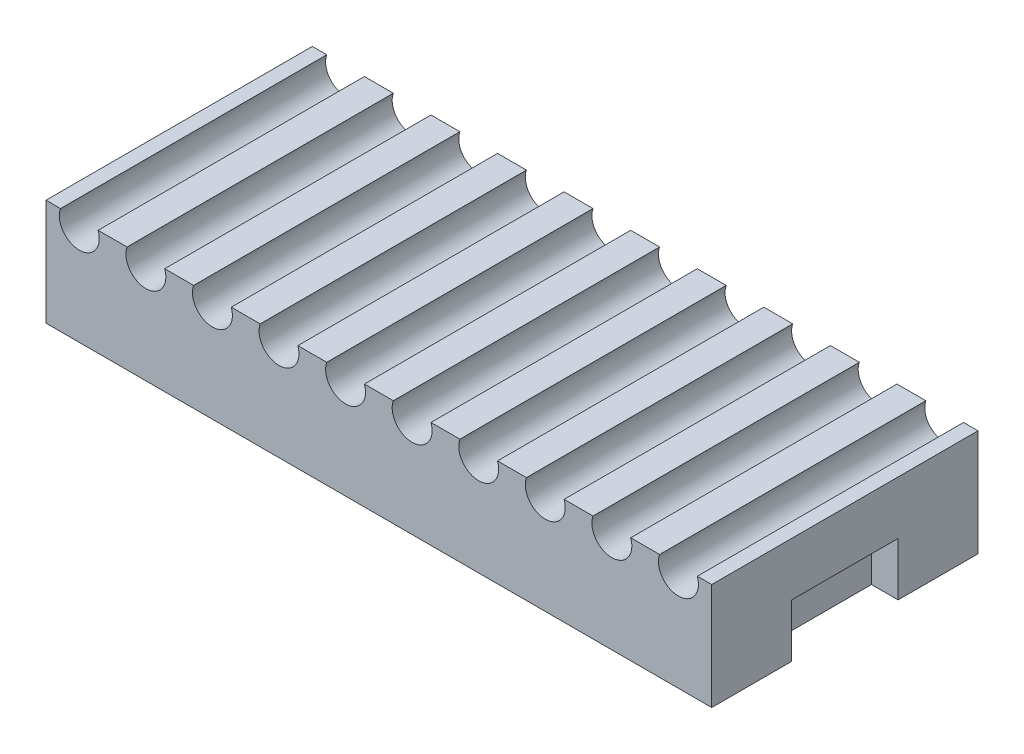
ISO-10303-21;
HEADER;
FILE_DESCRIPTION(('STEP AP214'),'2;1');
FILE_NAME('part.step','',(''),(''),'','','');
FILE_SCHEMA(('AUTOMOTIVE_DESIGN { 1 0 10303 214 1 1 1 1 }'));
ENDSEC;
DATA;
#1=APPLICATION_CONTEXT('core data for automotive mechanical design processes');
#2=APPLICATION_PROTOCOL_DEFINITION('international standard','automotive_design',2000,#1);
#3=PRODUCT_CONTEXT('',#1,'mechanical');
#4=PRODUCT('Part','Part','',(#3));
#5=PRODUCT_RELATED_PRODUCT_CATEGORY('part','',(#4));
#6=PRODUCT_DEFINITION_FORMATION('','',#4);
#7=PRODUCT_DEFINITION_CONTEXT('part definition',#1,'design');
#8=PRODUCT_DEFINITION('design','',#6,#7);
#9=PRODUCT_DEFINITION_SHAPE('','',#8);
#10=(LENGTH_UNIT() NAMED_UNIT(*) SI_UNIT(.MILLI.,.METRE.));
#11=(NAMED_UNIT(*) PLANE_ANGLE_UNIT() SI_UNIT($,.RADIAN.));
#12=(NAMED_UNIT(*) SI_UNIT($,.STERADIAN.) SOLID_ANGLE_UNIT());
#13=UNCERTAINTY_MEASURE_WITH_UNIT(LENGTH_MEASURE(1.E-05),#10,'distance_accuracy_value','');
#14=(GEOMETRIC_REPRESENTATION_CONTEXT(3) GLOBAL_UNCERTAINTY_ASSIGNED_CONTEXT((#13)) GLOBAL_UNIT_ASSIGNED_CONTEXT((#10,
#11,#12)) REPRESENTATION_CONTEXT('',''));
#15=CARTESIAN_POINT('',(0.,0.,0.));
#16=DIRECTION('',(0.,0.,1.));
#17=DIRECTION('',(1.,0.,0.));
#18=AXIS2_PLACEMENT_3D('',#15,#16,#17);
#19=CARTESIAN_POINT('',(-12.5,2.,10.));
#20=DIRECTION('',(1.,0.,0.));
#21=DIRECTION('',(0.,0.,-1.));
#22=AXIS2_PLACEMENT_3D('',#19,#20,#21);
#23=PLANE('',#22);
#24=DIRECTION('',(0.,1.,0.));
#25=VECTOR('',#24,1.);
#26=CARTESIAN_POINT('',(-12.5,0.,3.));
#27=LINE('',#26,#25);
#28=CARTESIAN_POINT('',(-12.5,-2.,3.));
#29=VERTEX_POINT('',#28);
#30=CARTESIAN_POINT('',(-12.5,0.,3.));
#31=VERTEX_POINT('',#30);
#32=EDGE_CURVE('E1135',#29,#31,#27,.T.);
#33=ORIENTED_EDGE('',*,*,#32,.T.);
#34=DIRECTION('',(0.,0.,1.));
#35=VECTOR('',#34,1.);
#36=CARTESIAN_POINT('',(-12.5,0.,7.));
#37=LINE('',#36,#35);
#38=CARTESIAN_POINT('',(-12.5,0.,7.));
#39=VERTEX_POINT('',#38);
#40=EDGE_CURVE('E1130',#31,#39,#37,.T.);
#41=ORIENTED_EDGE('',*,*,#40,.T.);
#42=DIRECTION('',(0.,-1.,0.));
#43=VECTOR('',#42,1.);
#44=CARTESIAN_POINT('',(-12.5,0.,7.));
#45=LINE('',#44,#43);
#46=CARTESIAN_POINT('',(-12.5,-2.,7.));
#47=VERTEX_POINT('',#46);
#48=EDGE_CURVE('E1133',#39,#47,#45,.T.);
#49=ORIENTED_EDGE('',*,*,#48,.T.);
#50=DIRECTION('',(0.,0.,-1.));
#51=VECTOR('',#50,1.);
#52=CARTESIAN_POINT('',(-12.5,-2.,10.));
#53=LINE('',#52,#51);
#54=CARTESIAN_POINT('',(-12.5,-2.,10.));
#55=VERTEX_POINT('',#54);
#56=EDGE_CURVE('E281',#55,#47,#53,.T.);
#57=ORIENTED_EDGE('',*,*,#56,.F.);
#58=DIRECTION('',(0.,-1.,0.));
#59=VECTOR('',#58,1.);
#60=CARTESIAN_POINT('',(-12.5,2.,10.));
#61=LINE('',#60,#59);
#62=CARTESIAN_POINT('',(-12.5,2.,10.));
#63=VERTEX_POINT('',#62);
#64=EDGE_CURVE('E459',#63,#55,#61,.T.);
#65=ORIENTED_EDGE('',*,*,#64,.F.);
#66=DIRECTION('',(0.,0.,-1.));
#67=VECTOR('',#66,1.);
#68=CARTESIAN_POINT('',(-12.5,2.,10.));
#69=LINE('',#68,#67);
#70=CARTESIAN_POINT('',(-12.5,2.,0.));
#71=VERTEX_POINT('',#70);
#72=EDGE_CURVE('E490',#63,#71,#69,.T.);
#73=ORIENTED_EDGE('',*,*,#72,.T.);
#74=DIRECTION('',(0.,-1.,0.));
#75=VECTOR('',#74,1.);
#76=CARTESIAN_POINT('',(-12.5,2.,0.));
#77=LINE('',#76,#75);
#78=CARTESIAN_POINT('',(-12.5,-2.,0.));
#79=VERTEX_POINT('',#78);
#80=EDGE_CURVE('E475',#71,#79,#77,.T.);
#81=ORIENTED_EDGE('',*,*,#80,.T.);
#82=EDGE_CURVE('E487',#29,#79,#53,.T.);
#83=ORIENTED_EDGE('',*,*,#82,.F.);
#84=EDGE_LOOP('',(#33,#41,#49,#57,#65,#73,#81,#83));
#85=FACE_BOUND('',#84,.T.);
#86=ADVANCED_FACE('F47',(#85),#23,.F.);
#87=CARTESIAN_POINT('',(-12.5,-2.,10.));
#88=DIRECTION('',(0.,1.,0.));
#89=DIRECTION('',(0.,0.,1.));
#90=AXIS2_PLACEMENT_3D('',#87,#88,#89);
#91=PLANE('',#90);
#92=DIRECTION('',(-1.,0.,0.));
#93=VECTOR('',#92,1.);
#94=CARTESIAN_POINT('',(-11.5,-2.,3.));
#95=LINE('',#94,#93);
#96=CARTESIAN_POINT('',(-11.5,-2.,3.));
#97=VERTEX_POINT('',#96);
#98=EDGE_CURVE('E283',#97,#29,#95,.T.);
#99=ORIENTED_EDGE('',*,*,#98,.T.);
#100=ORIENTED_EDGE('',*,*,#82,.T.);
#101=DIRECTION('',(1.,0.,0.));
#102=VECTOR('',#101,1.);
#103=CARTESIAN_POINT('',(-12.5,-2.,0.));
#104=LINE('',#103,#102);
#105=CARTESIAN_POINT('',(12.5,-2.,0.));
#106=VERTEX_POINT('',#105);
#107=EDGE_CURVE('E454',#79,#106,#104,.T.);
#108=ORIENTED_EDGE('',*,*,#107,.T.);
#109=DIRECTION('',(0.,0.,-1.));
#110=VECTOR('',#109,1.);
#111=CARTESIAN_POINT('',(12.5,-2.,10.));
#112=LINE('',#111,#110);
#113=CARTESIAN_POINT('',(12.5,-2.,3.));
#114=VERTEX_POINT('',#113);
#115=EDGE_CURVE('E466',#114,#106,#112,.T.);
#116=ORIENTED_EDGE('',*,*,#115,.F.);
#117=DIRECTION('',(1.,0.,0.));
#118=VECTOR('',#117,1.);
#119=CARTESIAN_POINT('',(11.5,-2.,3.));
#120=LINE('',#119,#118);
#121=CARTESIAN_POINT('',(11.5,-2.,3.));
#122=VERTEX_POINT('',#121);
#123=EDGE_CURVE('E316',#122,#114,#120,.T.);
#124=ORIENTED_EDGE('',*,*,#123,.F.);
#125=DIRECTION('',(0.,0.,-1.));
#126=VECTOR('',#125,1.);
#127=CARTESIAN_POINT('',(11.5,-2.,7.));
#128=LINE('',#127,#126);
#129=CARTESIAN_POINT('',(11.5,-2.,7.));
#130=VERTEX_POINT('',#129);
#131=EDGE_CURVE('E302',#130,#122,#128,.T.);
#132=ORIENTED_EDGE('',*,*,#131,.F.);
#133=DIRECTION('',(1.,0.,0.));
#134=VECTOR('',#133,1.);
#135=CARTESIAN_POINT('',(11.5,-2.,7.));
#136=LINE('',#135,#134);
#137=CARTESIAN_POINT('',(12.5,-2.,7.));
#138=VERTEX_POINT('',#137);
#139=EDGE_CURVE('E320',#130,#138,#136,.T.);
#140=ORIENTED_EDGE('',*,*,#139,.T.);
#141=CARTESIAN_POINT('',(12.5,-2.,10.));
#142=VERTEX_POINT('',#141);
#143=EDGE_CURVE('E483',#142,#138,#112,.T.);
#144=ORIENTED_EDGE('',*,*,#143,.F.);
#145=DIRECTION('',(1.,0.,0.));
#146=VECTOR('',#145,1.);
#147=CARTESIAN_POINT('',(-12.5,-2.,10.));
#148=LINE('',#147,#146);
#149=EDGE_CURVE('E463',#55,#142,#148,.T.);
#150=ORIENTED_EDGE('',*,*,#149,.F.);
#151=ORIENTED_EDGE('',*,*,#56,.T.);
#152=DIRECTION('',(-1.,0.,0.));
#153=VECTOR('',#152,1.);
#154=CARTESIAN_POINT('',(-11.5,-2.,7.));
#155=LINE('',#154,#153);
#156=CARTESIAN_POINT('',(-11.5,-2.,7.));
#157=VERTEX_POINT('',#156);
#158=EDGE_CURVE('E264',#157,#47,#155,.T.);
#159=ORIENTED_EDGE('',*,*,#158,.F.);
#160=DIRECTION('',(0.,0.,-1.));
#161=VECTOR('',#160,1.);
#162=CARTESIAN_POINT('',(-11.5,-2.,7.));
#163=LINE('',#162,#161);
#164=EDGE_CURVE('E269',#157,#97,#163,.T.);
#165=ORIENTED_EDGE('',*,*,#164,.T.);
#166=EDGE_LOOP('',(#99,#100,#108,#116,#124,#132,#140,#144,#150,#151,#159,#165));
#167=FACE_BOUND('',#166,.T.);
#168=ADVANCED_FACE('F278',(#167),#91,.F.);
#169=CARTESIAN_POINT('',(-12.5,2.,10.));
#170=DIRECTION('',(0.,-1.,0.));
#171=DIRECTION('',(0.,0.,-1.));
#172=AXIS2_PLACEMENT_3D('',#169,#170,#171);
#173=PLANE('',#172);
#174=DIRECTION('',(-1.,0.,0.));
#175=VECTOR('',#174,1.);
#176=CARTESIAN_POINT('',(-12.5,2.,10.));
#177=LINE('',#176,#175);
#178=CARTESIAN_POINT('',(10.5428932188135,2.,10.));
#179=VERTEX_POINT('',#178);
#180=CARTESIAN_POINT('',(9.45710678118655,2.,10.));
#181=VERTEX_POINT('',#180);
#182=EDGE_CURVE('E460',#179,#181,#177,.T.);
#183=ORIENTED_EDGE('',*,*,#182,.F.);
#184=DIRECTION('',(0.,0.,-1.));
#185=VECTOR('',#184,1.);
#186=CARTESIAN_POINT('',(10.5428932188135,2.,10.));
#187=LINE('',#186,#185);
#188=CARTESIAN_POINT('',(10.5428932188135,2.,0.));
#189=VERTEX_POINT('',#188);
#190=EDGE_CURVE('E444',#179,#189,#187,.T.);
#191=ORIENTED_EDGE('',*,*,#190,.T.);
#192=DIRECTION('',(-1.,0.,0.));
#193=VECTOR('',#192,1.);
#194=CARTESIAN_POINT('',(-12.5,2.,0.));
#195=LINE('',#194,#193);
#196=CARTESIAN_POINT('',(9.45710678118655,2.,0.));
#197=VERTEX_POINT('',#196);
#198=EDGE_CURVE('E476',#189,#197,#195,.T.);
#199=ORIENTED_EDGE('',*,*,#198,.T.);
#200=DIRECTION('',(0.,0.,-1.));
#201=VECTOR('',#200,1.);
#202=CARTESIAN_POINT('',(9.45710678118655,2.,10.));
#203=LINE('',#202,#201);
#204=EDGE_CURVE('E432',#197,#181,#203,.F.);
#205=ORIENTED_EDGE('',*,*,#204,.T.);
#206=EDGE_LOOP('',(#183,#191,#199,#205));
#207=FACE_BOUND('',#206,.T.);
#208=ADVANCED_FACE('F541',(#207),#173,.F.);
#209=CARTESIAN_POINT('',(8.04289321881345,2.,10.));
#210=VERTEX_POINT('',#209);
#211=CARTESIAN_POINT('',(6.95710678118655,2.,10.));
#212=VERTEX_POINT('',#211);
#213=EDGE_CURVE('E600',#210,#212,#177,.T.);
#214=ORIENTED_EDGE('',*,*,#213,.F.);
#215=DIRECTION('',(0.,0.,-1.));
#216=VECTOR('',#215,1.);
#217=CARTESIAN_POINT('',(8.04289321881345,2.,10.));
#218=LINE('',#217,#216);
#219=CARTESIAN_POINT('',(8.04289321881345,2.,0.));
#220=VERTEX_POINT('',#219);
#221=EDGE_CURVE('E436',#210,#220,#218,.T.);
#222=ORIENTED_EDGE('',*,*,#221,.T.);
#223=CARTESIAN_POINT('',(6.95710678118655,2.,0.));
#224=VERTEX_POINT('',#223);
#225=EDGE_CURVE('E537',#220,#224,#195,.T.);
#226=ORIENTED_EDGE('',*,*,#225,.T.);
#227=DIRECTION('',(0.,0.,-1.));
#228=VECTOR('',#227,1.);
#229=CARTESIAN_POINT('',(6.95710678118655,2.,10.));
#230=LINE('',#229,#228);
#231=EDGE_CURVE('E424',#224,#212,#230,.F.);
#232=ORIENTED_EDGE('',*,*,#231,.T.);
#233=EDGE_LOOP('',(#214,#222,#226,#232));
#234=FACE_BOUND('',#233,.T.);
#235=ADVANCED_FACE('F657',(#234),#173,.F.);
#236=CARTESIAN_POINT('',(5.54289321881345,2.,10.));
#237=VERTEX_POINT('',#236);
#238=CARTESIAN_POINT('',(4.45710678118655,2.,10.));
#239=VERTEX_POINT('',#238);
#240=EDGE_CURVE('E603',#237,#239,#177,.T.);
#241=ORIENTED_EDGE('',*,*,#240,.F.);
#242=DIRECTION('',(0.,0.,-1.));
#243=VECTOR('',#242,1.);
#244=CARTESIAN_POINT('',(5.54289321881345,2.,10.));
#245=LINE('',#244,#243);
#246=CARTESIAN_POINT('',(5.54289321881345,2.,0.));
#247=VERTEX_POINT('',#246);
#248=EDGE_CURVE('E428',#237,#247,#245,.T.);
#249=ORIENTED_EDGE('',*,*,#248,.T.);
#250=CARTESIAN_POINT('',(4.45710678118655,2.,0.));
#251=VERTEX_POINT('',#250);
#252=EDGE_CURVE('E545',#247,#251,#195,.T.);
#253=ORIENTED_EDGE('',*,*,#252,.T.);
#254=DIRECTION('',(0.,0.,-1.));
#255=VECTOR('',#254,1.);
#256=CARTESIAN_POINT('',(4.45710678118655,2.,10.));
#257=LINE('',#256,#255);
#258=EDGE_CURVE('E416',#251,#239,#257,.F.);
#259=ORIENTED_EDGE('',*,*,#258,.T.);
#260=EDGE_LOOP('',(#241,#249,#253,#259));
#261=FACE_BOUND('',#260,.T.);
#262=ADVANCED_FACE('F653',(#261),#173,.F.);
#263=CARTESIAN_POINT('',(3.04289321881345,2.,10.));
#264=VERTEX_POINT('',#263);
#265=CARTESIAN_POINT('',(1.95710678118655,2.,10.));
#266=VERTEX_POINT('',#265);
#267=EDGE_CURVE('E606',#264,#266,#177,.T.);
#268=ORIENTED_EDGE('',*,*,#267,.F.);
#269=DIRECTION('',(0.,0.,-1.));
#270=VECTOR('',#269,1.);
#271=CARTESIAN_POINT('',(3.04289321881345,2.,10.));
#272=LINE('',#271,#270);
#273=CARTESIAN_POINT('',(3.04289321881345,2.,0.));
#274=VERTEX_POINT('',#273);
#275=EDGE_CURVE('E420',#264,#274,#272,.T.);
#276=ORIENTED_EDGE('',*,*,#275,.T.);
#277=CARTESIAN_POINT('',(1.95710678118655,2.,0.));
#278=VERTEX_POINT('',#277);
#279=EDGE_CURVE('E549',#274,#278,#195,.T.);
#280=ORIENTED_EDGE('',*,*,#279,.T.);
#281=DIRECTION('',(0.,0.,-1.));
#282=VECTOR('',#281,1.);
#283=CARTESIAN_POINT('',(1.95710678118655,2.,10.));
#284=LINE('',#283,#282);
#285=EDGE_CURVE('E408',#278,#266,#284,.F.);
#286=ORIENTED_EDGE('',*,*,#285,.T.);
#287=EDGE_LOOP('',(#268,#276,#280,#286));
#288=FACE_BOUND('',#287,.T.);
#289=ADVANCED_FACE('F649',(#288),#173,.F.);
#290=CARTESIAN_POINT('',(0.542893218813452,2.,10.));
#291=VERTEX_POINT('',#290);
#292=CARTESIAN_POINT('',(-0.542893218813454,2.,10.));
#293=VERTEX_POINT('',#292);
#294=EDGE_CURVE('E609',#291,#293,#177,.T.);
#295=ORIENTED_EDGE('',*,*,#294,.F.);
#296=DIRECTION('',(0.,0.,-1.));
#297=VECTOR('',#296,1.);
#298=CARTESIAN_POINT('',(0.542893218813452,2.,10.));
#299=LINE('',#298,#297);
#300=CARTESIAN_POINT('',(0.542893218813452,2.,0.));
#301=VERTEX_POINT('',#300);
#302=EDGE_CURVE('E412',#291,#301,#299,.T.);
#303=ORIENTED_EDGE('',*,*,#302,.T.);
#304=CARTESIAN_POINT('',(-0.542893218813454,2.,0.));
#305=VERTEX_POINT('',#304);
#306=EDGE_CURVE('E554',#301,#305,#195,.T.);
#307=ORIENTED_EDGE('',*,*,#306,.T.);
#308=DIRECTION('',(0.,0.,-1.));
#309=VECTOR('',#308,1.);
#310=CARTESIAN_POINT('',(-0.542893218813454,2.,10.));
#311=LINE('',#310,#309);
#312=EDGE_CURVE('E400',#305,#293,#311,.F.);
#313=ORIENTED_EDGE('',*,*,#312,.T.);
#314=EDGE_LOOP('',(#295,#303,#307,#313));
#315=FACE_BOUND('',#314,.T.);
#316=ADVANCED_FACE('F645',(#315),#173,.F.);
#317=CARTESIAN_POINT('',(-1.95710678118655,2.,10.));
#318=VERTEX_POINT('',#317);
#319=CARTESIAN_POINT('',(-3.04289321881345,2.,10.));
#320=VERTEX_POINT('',#319);
#321=EDGE_CURVE('E612',#318,#320,#177,.T.);
#322=ORIENTED_EDGE('',*,*,#321,.F.);
#323=DIRECTION('',(0.,0.,-1.));
#324=VECTOR('',#323,1.);
#325=CARTESIAN_POINT('',(-1.95710678118655,2.,10.));
#326=LINE('',#325,#324);
#327=CARTESIAN_POINT('',(-1.95710678118655,2.,0.));
#328=VERTEX_POINT('',#327);
#329=EDGE_CURVE('E404',#318,#328,#326,.T.);
#330=ORIENTED_EDGE('',*,*,#329,.T.);
#331=CARTESIAN_POINT('',(-3.04289321881345,2.,0.));
#332=VERTEX_POINT('',#331);
#333=EDGE_CURVE('E559',#328,#332,#195,.T.);
#334=ORIENTED_EDGE('',*,*,#333,.T.);
#335=DIRECTION('',(0.,0.,-1.));
#336=VECTOR('',#335,1.);
#337=CARTESIAN_POINT('',(-3.04289321881345,2.,10.));
#338=LINE('',#337,#336);
#339=EDGE_CURVE('E392',#332,#320,#338,.F.);
#340=ORIENTED_EDGE('',*,*,#339,.T.);
#341=EDGE_LOOP('',(#322,#330,#334,#340));
#342=FACE_BOUND('',#341,.T.);
#343=ADVANCED_FACE('F641',(#342),#173,.F.);
#344=CARTESIAN_POINT('',(-4.45710678118655,2.,10.));
#345=VERTEX_POINT('',#344);
#346=CARTESIAN_POINT('',(-5.54289321881345,2.,10.));
#347=VERTEX_POINT('',#346);
#348=EDGE_CURVE('E615',#345,#347,#177,.T.);
#349=ORIENTED_EDGE('',*,*,#348,.F.);
#350=DIRECTION('',(0.,0.,-1.));
#351=VECTOR('',#350,1.);
#352=CARTESIAN_POINT('',(-4.45710678118655,2.,10.));
#353=LINE('',#352,#351);
#354=CARTESIAN_POINT('',(-4.45710678118655,2.,0.));
#355=VERTEX_POINT('',#354);
#356=EDGE_CURVE('E396',#345,#355,#353,.T.);
#357=ORIENTED_EDGE('',*,*,#356,.T.);
#358=CARTESIAN_POINT('',(-5.54289321881345,2.,0.));
#359=VERTEX_POINT('',#358);
#360=EDGE_CURVE('E564',#355,#359,#195,.T.);
#361=ORIENTED_EDGE('',*,*,#360,.T.);
#362=DIRECTION('',(0.,0.,-1.));
#363=VECTOR('',#362,1.);
#364=CARTESIAN_POINT('',(-5.54289321881345,2.,10.));
#365=LINE('',#364,#363);
#366=EDGE_CURVE('E384',#359,#347,#365,.F.);
#367=ORIENTED_EDGE('',*,*,#366,.T.);
#368=EDGE_LOOP('',(#349,#357,#361,#367));
#369=FACE_BOUND('',#368,.T.);
#370=ADVANCED_FACE('F637',(#369),#173,.F.);
#371=CARTESIAN_POINT('',(-6.95710678118655,2.,10.));
#372=VERTEX_POINT('',#371);
#373=CARTESIAN_POINT('',(-8.04289321881345,2.,10.));
#374=VERTEX_POINT('',#373);
#375=EDGE_CURVE('E618',#372,#374,#177,.T.);
#376=ORIENTED_EDGE('',*,*,#375,.F.);
#377=DIRECTION('',(0.,0.,-1.));
#378=VECTOR('',#377,1.);
#379=CARTESIAN_POINT('',(-6.95710678118655,2.,10.));
#380=LINE('',#379,#378);
#381=CARTESIAN_POINT('',(-6.95710678118655,2.,0.));
#382=VERTEX_POINT('',#381);
#383=EDGE_CURVE('E388',#372,#382,#380,.T.);
#384=ORIENTED_EDGE('',*,*,#383,.T.);
#385=CARTESIAN_POINT('',(-8.04289321881345,2.,0.));
#386=VERTEX_POINT('',#385);
#387=EDGE_CURVE('E569',#382,#386,#195,.T.);
#388=ORIENTED_EDGE('',*,*,#387,.T.);
#389=DIRECTION('',(0.,0.,-1.));
#390=VECTOR('',#389,1.);
#391=CARTESIAN_POINT('',(-8.04289321881345,2.,10.));
#392=LINE('',#391,#390);
#393=EDGE_CURVE('E376',#386,#374,#392,.F.);
#394=ORIENTED_EDGE('',*,*,#393,.T.);
#395=EDGE_LOOP('',(#376,#384,#388,#394));
#396=FACE_BOUND('',#395,.T.);
#397=ADVANCED_FACE('F633',(#396),#173,.F.);
#398=CARTESIAN_POINT('',(-9.45710678118655,2.,10.));
#399=VERTEX_POINT('',#398);
#400=CARTESIAN_POINT('',(-10.5428932188135,2.,10.));
#401=VERTEX_POINT('',#400);
#402=EDGE_CURVE('E621',#399,#401,#177,.T.);
#403=ORIENTED_EDGE('',*,*,#402,.F.);
#404=DIRECTION('',(0.,0.,-1.));
#405=VECTOR('',#404,1.);
#406=CARTESIAN_POINT('',(-9.45710678118655,2.,10.));
#407=LINE('',#406,#405);
#408=CARTESIAN_POINT('',(-9.45710678118655,2.,0.));
#409=VERTEX_POINT('',#408);
#410=EDGE_CURVE('E380',#399,#409,#407,.T.);
#411=ORIENTED_EDGE('',*,*,#410,.T.);
#412=CARTESIAN_POINT('',(-10.5428932188135,2.,0.));
#413=VERTEX_POINT('',#412);
#414=EDGE_CURVE('E574',#409,#413,#195,.T.);
#415=ORIENTED_EDGE('',*,*,#414,.T.);
#416=DIRECTION('',(0.,0.,-1.));
#417=VECTOR('',#416,1.);
#418=CARTESIAN_POINT('',(-10.5428932188135,2.,10.));
#419=LINE('',#418,#417);
#420=EDGE_CURVE('E333',#413,#401,#419,.F.);
#421=ORIENTED_EDGE('',*,*,#420,.T.);
#422=EDGE_LOOP('',(#403,#411,#415,#421));
#423=FACE_BOUND('',#422,.T.);
#424=ADVANCED_FACE('F629',(#423),#173,.F.);
#425=CARTESIAN_POINT('',(-11.9571067811865,2.,10.));
#426=VERTEX_POINT('',#425);
#427=EDGE_CURVE('E453',#426,#63,#177,.T.);
#428=ORIENTED_EDGE('',*,*,#427,.F.);
#429=DIRECTION('',(0.,0.,-1.));
#430=VECTOR('',#429,1.);
#431=CARTESIAN_POINT('',(-11.9571067811865,2.,10.));
#432=LINE('',#431,#430);
#433=CARTESIAN_POINT('',(-11.9571067811865,2.,0.));
#434=VERTEX_POINT('',#433);
#435=EDGE_CURVE('E372',#426,#434,#432,.T.);
#436=ORIENTED_EDGE('',*,*,#435,.T.);
#437=EDGE_CURVE('E470',#434,#71,#195,.T.);
#438=ORIENTED_EDGE('',*,*,#437,.T.);
#439=ORIENTED_EDGE('',*,*,#72,.F.);
#440=EDGE_LOOP('',(#428,#436,#438,#439));
#441=FACE_BOUND('',#440,.T.);
#442=ADVANCED_FACE('F586',(#441),#173,.F.);
#443=CARTESIAN_POINT('',(12.5,2.,10.));
#444=DIRECTION('',(-1.,0.,0.));
#445=DIRECTION('',(0.,0.,1.));
#446=AXIS2_PLACEMENT_3D('',#443,#444,#445);
#447=PLANE('',#446);
#448=DIRECTION('',(0.,0.,1.));
#449=VECTOR('',#448,1.);
#450=CARTESIAN_POINT('',(12.5,0.,7.));
#451=LINE('',#450,#449);
#452=CARTESIAN_POINT('',(12.5,0.,3.));
#453=VERTEX_POINT('',#452);
#454=CARTESIAN_POINT('',(12.5,0.,7.));
#455=VERTEX_POINT('',#454);
#456=EDGE_CURVE('E310',#453,#455,#451,.T.);
#457=ORIENTED_EDGE('',*,*,#456,.F.);
#458=DIRECTION('',(0.,1.,0.));
#459=VECTOR('',#458,1.);
#460=CARTESIAN_POINT('',(12.5,0.,3.));
#461=LINE('',#460,#459);
#462=EDGE_CURVE('E306',#114,#453,#461,.T.);
#463=ORIENTED_EDGE('',*,*,#462,.F.);
#464=ORIENTED_EDGE('',*,*,#115,.T.);
#465=DIRECTION('',(0.,1.,0.));
#466=VECTOR('',#465,1.);
#467=CARTESIAN_POINT('',(12.5,2.,0.));
#468=LINE('',#467,#466);
#469=CARTESIAN_POINT('',(12.5,2.,0.));
#470=VERTEX_POINT('',#469);
#471=EDGE_CURVE('E448',#106,#470,#468,.T.);
#472=ORIENTED_EDGE('',*,*,#471,.T.);
#473=DIRECTION('',(0.,0.,-1.));
#474=VECTOR('',#473,1.);
#475=CARTESIAN_POINT('',(12.5,2.,10.));
#476=LINE('',#475,#474);
#477=CARTESIAN_POINT('',(12.5,2.,10.));
#478=VERTEX_POINT('',#477);
#479=EDGE_CURVE('E494',#478,#470,#476,.T.);
#480=ORIENTED_EDGE('',*,*,#479,.F.);
#481=DIRECTION('',(0.,1.,0.));
#482=VECTOR('',#481,1.);
#483=CARTESIAN_POINT('',(12.5,2.,10.));
#484=LINE('',#483,#482);
#485=EDGE_CURVE('E449',#142,#478,#484,.T.);
#486=ORIENTED_EDGE('',*,*,#485,.F.);
#487=ORIENTED_EDGE('',*,*,#143,.T.);
#488=DIRECTION('',(0.,-1.,0.));
#489=VECTOR('',#488,1.);
#490=CARTESIAN_POINT('',(12.5,0.,7.));
#491=LINE('',#490,#489);
#492=EDGE_CURVE('E297',#455,#138,#491,.T.);
#493=ORIENTED_EDGE('',*,*,#492,.F.);
#494=EDGE_LOOP('',(#457,#463,#464,#472,#480,#486,#487,#493));
#495=FACE_BOUND('',#494,.T.);
#496=ADVANCED_FACE('F49',(#495),#447,.F.);
#497=CARTESIAN_POINT('',(11.9571067811865,2.,0.));
#498=VERTEX_POINT('',#497);
#499=EDGE_CURVE('E471',#470,#498,#195,.T.);
#500=ORIENTED_EDGE('',*,*,#499,.T.);
#501=DIRECTION('',(0.,0.,-1.));
#502=VECTOR('',#501,1.);
#503=CARTESIAN_POINT('',(11.9571067811865,2.,10.));
#504=LINE('',#503,#502);
#505=CARTESIAN_POINT('',(11.9571067811865,2.,10.));
#506=VERTEX_POINT('',#505);
#507=EDGE_CURVE('E440',#498,#506,#504,.F.);
#508=ORIENTED_EDGE('',*,*,#507,.T.);
#509=EDGE_CURVE('E455',#478,#506,#177,.T.);
#510=ORIENTED_EDGE('',*,*,#509,.F.);
#511=ORIENTED_EDGE('',*,*,#479,.T.);
#512=EDGE_LOOP('',(#500,#508,#510,#511));
#513=FACE_BOUND('',#512,.T.);
#514=ADVANCED_FACE('F677',(#513),#173,.F.);
#515=CARTESIAN_POINT('',(0.,0.,10.));
#516=DIRECTION('',(0.,0.,1.));
#517=DIRECTION('',(1.,0.,0.));
#518=AXIS2_PLACEMENT_3D('',#515,#516,#517);
#519=PLANE('',#518);
#520=CARTESIAN_POINT('',(11.25,1.75,10.));
#521=DIRECTION('',(0.,0.,-1.));
#522=DIRECTION('',(-1.,0.,0.));
#523=AXIS2_PLACEMENT_3D('',#520,#521,#522);
#524=CIRCLE('',#523,0.75);
#525=EDGE_CURVE('E329',#506,#179,#524,.T.);
#526=ORIENTED_EDGE('',*,*,#525,.T.);
#527=ORIENTED_EDGE('',*,*,#182,.T.);
#528=CARTESIAN_POINT('',(8.75,1.75,10.));
#529=DIRECTION('',(0.,0.,-1.));
#530=DIRECTION('',(-1.,0.,0.));
#531=AXIS2_PLACEMENT_3D('',#528,#529,#530);
#532=CIRCLE('',#531,0.75);
#533=EDGE_CURVE('E334',#181,#210,#532,.T.);
#534=ORIENTED_EDGE('',*,*,#533,.T.);
#535=ORIENTED_EDGE('',*,*,#213,.T.);
#536=CARTESIAN_POINT('',(6.25,1.75,10.));
#537=DIRECTION('',(0.,0.,-1.));
#538=DIRECTION('',(-1.,0.,0.));
#539=AXIS2_PLACEMENT_3D('',#536,#537,#538);
#540=CIRCLE('',#539,0.749999999999999);
#541=EDGE_CURVE('E338',#212,#237,#540,.T.);
#542=ORIENTED_EDGE('',*,*,#541,.T.);
#543=ORIENTED_EDGE('',*,*,#240,.T.);
#544=CARTESIAN_POINT('',(3.75,1.75,10.));
#545=DIRECTION('',(0.,0.,-1.));
#546=DIRECTION('',(-1.,0.,0.));
#547=AXIS2_PLACEMENT_3D('',#544,#545,#546);
#548=CIRCLE('',#547,0.75);
#549=EDGE_CURVE('E342',#239,#264,#548,.T.);
#550=ORIENTED_EDGE('',*,*,#549,.T.);
#551=ORIENTED_EDGE('',*,*,#267,.T.);
#552=CARTESIAN_POINT('',(1.25,1.75,10.));
#553=DIRECTION('',(0.,0.,-1.));
#554=DIRECTION('',(-1.,0.,0.));
#555=AXIS2_PLACEMENT_3D('',#552,#553,#554);
#556=CIRCLE('',#555,0.75);
#557=EDGE_CURVE('E346',#266,#291,#556,.T.);
#558=ORIENTED_EDGE('',*,*,#557,.T.);
#559=ORIENTED_EDGE('',*,*,#294,.T.);
#560=CARTESIAN_POINT('',(-1.25,1.75,10.));
#561=DIRECTION('',(0.,0.,-1.));
#562=DIRECTION('',(-1.,0.,0.));
#563=AXIS2_PLACEMENT_3D('',#560,#561,#562);
#564=CIRCLE('',#563,0.75);
#565=EDGE_CURVE('E350',#293,#318,#564,.T.);
#566=ORIENTED_EDGE('',*,*,#565,.T.);
#567=ORIENTED_EDGE('',*,*,#321,.T.);
#568=CARTESIAN_POINT('',(-3.75,1.75,10.));
#569=DIRECTION('',(0.,0.,-1.));
#570=DIRECTION('',(-1.,0.,0.));
#571=AXIS2_PLACEMENT_3D('',#568,#569,#570);
#572=CIRCLE('',#571,0.75);
#573=EDGE_CURVE('E354',#320,#345,#572,.T.);
#574=ORIENTED_EDGE('',*,*,#573,.T.);
#575=ORIENTED_EDGE('',*,*,#348,.T.);
#576=CARTESIAN_POINT('',(-6.25,1.75,10.));
#577=DIRECTION('',(0.,0.,-1.));
#578=DIRECTION('',(-1.,0.,0.));
#579=AXIS2_PLACEMENT_3D('',#576,#577,#578);
#580=CIRCLE('',#579,0.75);
#581=EDGE_CURVE('E358',#347,#372,#580,.T.);
#582=ORIENTED_EDGE('',*,*,#581,.T.);
#583=ORIENTED_EDGE('',*,*,#375,.T.);
#584=CARTESIAN_POINT('',(-8.75,1.75,10.));
#585=DIRECTION('',(0.,0.,-1.));
#586=DIRECTION('',(-1.,0.,0.));
#587=AXIS2_PLACEMENT_3D('',#584,#585,#586);
#588=CIRCLE('',#587,0.75);
#589=EDGE_CURVE('E362',#374,#399,#588,.T.);
#590=ORIENTED_EDGE('',*,*,#589,.T.);
#591=ORIENTED_EDGE('',*,*,#402,.T.);
#592=CARTESIAN_POINT('',(-11.25,1.75,10.));
#593=DIRECTION('',(0.,0.,-1.));
#594=DIRECTION('',(-1.,0.,0.));
#595=AXIS2_PLACEMENT_3D('',#592,#593,#594);
#596=CIRCLE('',#595,0.75);
#597=EDGE_CURVE('E319',#401,#426,#596,.T.);
#598=ORIENTED_EDGE('',*,*,#597,.T.);
#599=ORIENTED_EDGE('',*,*,#427,.T.);
#600=ORIENTED_EDGE('',*,*,#64,.T.);
#601=ORIENTED_EDGE('',*,*,#149,.T.);
#602=ORIENTED_EDGE('',*,*,#485,.T.);
#603=ORIENTED_EDGE('',*,*,#509,.T.);
#604=EDGE_LOOP('',(#526,#527,#534,#535,#542,#543,#550,#551,#558,#559,#566,#567,#574,#575,#582,
#583,#590,#591,#598,#599,#600,#601,#602,#603));
#605=FACE_BOUND('',#604,.T.);
#606=ADVANCED_FACE('F625',(#605),#519,.T.);
#607=CARTESIAN_POINT('',(0.,0.,0.));
#608=DIRECTION('',(0.,0.,1.));
#609=DIRECTION('',(1.,0.,0.));
#610=AXIS2_PLACEMENT_3D('',#607,#608,#609);
#611=PLANE('',#610);
#612=ORIENTED_EDGE('',*,*,#198,.F.);
#613=CARTESIAN_POINT('',(11.25,1.75,0.));
#614=DIRECTION('',(0.,0.,1.));
#615=DIRECTION('',(1.,0.,0.));
#616=AXIS2_PLACEMENT_3D('',#613,#614,#615);
#617=CIRCLE('',#616,0.75);
#618=EDGE_CURVE('E11',#189,#498,#617,.T.);
#619=ORIENTED_EDGE('',*,*,#618,.T.);
#620=ORIENTED_EDGE('',*,*,#499,.F.);
#621=ORIENTED_EDGE('',*,*,#471,.F.);
#622=ORIENTED_EDGE('',*,*,#107,.F.);
#623=ORIENTED_EDGE('',*,*,#80,.F.);
#624=ORIENTED_EDGE('',*,*,#437,.F.);
#625=CARTESIAN_POINT('',(-11.25,1.75,0.));
#626=DIRECTION('',(0.,0.,1.));
#627=DIRECTION('',(1.,0.,0.));
#628=AXIS2_PLACEMENT_3D('',#625,#626,#627);
#629=CIRCLE('',#628,0.75);
#630=EDGE_CURVE('E498',#434,#413,#629,.T.);
#631=ORIENTED_EDGE('',*,*,#630,.T.);
#632=ORIENTED_EDGE('',*,*,#414,.F.);
#633=CARTESIAN_POINT('',(-8.75,1.75,0.));
#634=DIRECTION('',(0.,0.,1.));
#635=DIRECTION('',(1.,0.,0.));
#636=AXIS2_PLACEMENT_3D('',#633,#634,#635);
#637=CIRCLE('',#636,0.75);
#638=EDGE_CURVE('E502',#409,#386,#637,.T.);
#639=ORIENTED_EDGE('',*,*,#638,.T.);
#640=ORIENTED_EDGE('',*,*,#387,.F.);
#641=CARTESIAN_POINT('',(-6.25,1.75,0.));
#642=DIRECTION('',(0.,0.,1.));
#643=DIRECTION('',(1.,0.,0.));
#644=AXIS2_PLACEMENT_3D('',#641,#642,#643);
#645=CIRCLE('',#644,0.75);
#646=EDGE_CURVE('E506',#382,#359,#645,.T.);
#647=ORIENTED_EDGE('',*,*,#646,.T.);
#648=ORIENTED_EDGE('',*,*,#360,.F.);
#649=CARTESIAN_POINT('',(-3.75,1.75,0.));
#650=DIRECTION('',(0.,0.,1.));
#651=DIRECTION('',(1.,0.,0.));
#652=AXIS2_PLACEMENT_3D('',#649,#650,#651);
#653=CIRCLE('',#652,0.75);
#654=EDGE_CURVE('E510',#355,#332,#653,.T.);
#655=ORIENTED_EDGE('',*,*,#654,.T.);
#656=ORIENTED_EDGE('',*,*,#333,.F.);
#657=CARTESIAN_POINT('',(-1.25,1.75,0.));
#658=DIRECTION('',(0.,0.,1.));
#659=DIRECTION('',(1.,0.,0.));
#660=AXIS2_PLACEMENT_3D('',#657,#658,#659);
#661=CIRCLE('',#660,0.75);
#662=EDGE_CURVE('E514',#328,#305,#661,.T.);
#663=ORIENTED_EDGE('',*,*,#662,.T.);
#664=ORIENTED_EDGE('',*,*,#306,.F.);
#665=CARTESIAN_POINT('',(1.25,1.75,0.));
#666=DIRECTION('',(0.,0.,1.));
#667=DIRECTION('',(1.,0.,0.));
#668=AXIS2_PLACEMENT_3D('',#665,#666,#667);
#669=CIRCLE('',#668,0.75);
#670=EDGE_CURVE('E518',#301,#278,#669,.T.);
#671=ORIENTED_EDGE('',*,*,#670,.T.);
#672=ORIENTED_EDGE('',*,*,#279,.F.);
#673=CARTESIAN_POINT('',(3.75,1.75,0.));
#674=DIRECTION('',(0.,0.,1.));
#675=DIRECTION('',(1.,0.,0.));
#676=AXIS2_PLACEMENT_3D('',#673,#674,#675);
#677=CIRCLE('',#676,0.75);
#678=EDGE_CURVE('E522',#274,#251,#677,.T.);
#679=ORIENTED_EDGE('',*,*,#678,.T.);
#680=ORIENTED_EDGE('',*,*,#252,.F.);
#681=CARTESIAN_POINT('',(6.25,1.75,0.));
#682=DIRECTION('',(0.,0.,1.));
#683=DIRECTION('',(1.,0.,0.));
#684=AXIS2_PLACEMENT_3D('',#681,#682,#683);
#685=CIRCLE('',#684,0.749999999999999);
#686=EDGE_CURVE('E526',#247,#224,#685,.T.);
#687=ORIENTED_EDGE('',*,*,#686,.T.);
#688=ORIENTED_EDGE('',*,*,#225,.F.);
#689=CARTESIAN_POINT('',(8.75,1.75,0.));
#690=DIRECTION('',(0.,0.,1.));
#691=DIRECTION('',(1.,0.,0.));
#692=AXIS2_PLACEMENT_3D('',#689,#690,#691);
#693=CIRCLE('',#692,0.75);
#694=EDGE_CURVE('E56',#220,#197,#693,.T.);
#695=ORIENTED_EDGE('',*,*,#694,.T.);
#696=EDGE_LOOP('',(#612,#619,#620,#621,#622,#623,#624,#631,#632,#639,#640,#647,#648,#655,#656,
#663,#664,#671,#672,#679,#680,#687,#688,#695));
#697=FACE_BOUND('',#696,.T.);
#698=ADVANCED_FACE('F535',(#697),#611,.F.);
#699=CARTESIAN_POINT('',(-11.25,1.75,10.));
#700=DIRECTION('',(0.,0.,-1.));
#701=DIRECTION('',(-1.,0.,0.));
#702=AXIS2_PLACEMENT_3D('',#699,#700,#701);
#703=CYLINDRICAL_SURFACE('',#702,0.75);
#704=ORIENTED_EDGE('',*,*,#597,.F.);
#705=ORIENTED_EDGE('',*,*,#420,.F.);
#706=ORIENTED_EDGE('',*,*,#630,.F.);
#707=ORIENTED_EDGE('',*,*,#435,.F.);
#708=EDGE_LOOP('',(#704,#705,#706,#707));
#709=FACE_BOUND('',#708,.T.);
#710=ADVANCED_FACE('F628',(#709),#703,.F.);
#711=CARTESIAN_POINT('',(-8.75,1.75,10.));
#712=DIRECTION('',(0.,0.,-1.));
#713=DIRECTION('',(-1.,0.,0.));
#714=AXIS2_PLACEMENT_3D('',#711,#712,#713);
#715=CYLINDRICAL_SURFACE('',#714,0.75);
#716=ORIENTED_EDGE('',*,*,#589,.F.);
#717=ORIENTED_EDGE('',*,*,#393,.F.);
#718=ORIENTED_EDGE('',*,*,#638,.F.);
#719=ORIENTED_EDGE('',*,*,#410,.F.);
#720=EDGE_LOOP('',(#716,#717,#718,#719));
#721=FACE_BOUND('',#720,.T.);
#722=ADVANCED_FACE('F631',(#721),#715,.F.);
#723=CARTESIAN_POINT('',(-6.25,1.75,10.));
#724=DIRECTION('',(0.,0.,-1.));
#725=DIRECTION('',(-1.,0.,0.));
#726=AXIS2_PLACEMENT_3D('',#723,#724,#725);
#727=CYLINDRICAL_SURFACE('',#726,0.75);
#728=ORIENTED_EDGE('',*,*,#581,.F.);
#729=ORIENTED_EDGE('',*,*,#366,.F.);
#730=ORIENTED_EDGE('',*,*,#646,.F.);
#731=ORIENTED_EDGE('',*,*,#383,.F.);
#732=EDGE_LOOP('',(#728,#729,#730,#731));
#733=FACE_BOUND('',#732,.T.);
#734=ADVANCED_FACE('F636',(#733),#727,.F.);
#735=CARTESIAN_POINT('',(-3.75,1.75,10.));
#736=DIRECTION('',(0.,0.,-1.));
#737=DIRECTION('',(-1.,0.,0.));
#738=AXIS2_PLACEMENT_3D('',#735,#736,#737);
#739=CYLINDRICAL_SURFACE('',#738,0.75);
#740=ORIENTED_EDGE('',*,*,#573,.F.);
#741=ORIENTED_EDGE('',*,*,#339,.F.);
#742=ORIENTED_EDGE('',*,*,#654,.F.);
#743=ORIENTED_EDGE('',*,*,#356,.F.);
#744=EDGE_LOOP('',(#740,#741,#742,#743));
#745=FACE_BOUND('',#744,.T.);
#746=ADVANCED_FACE('F639',(#745),#739,.F.);
#747=CARTESIAN_POINT('',(-1.25,1.75,10.));
#748=DIRECTION('',(0.,0.,-1.));
#749=DIRECTION('',(-1.,0.,0.));
#750=AXIS2_PLACEMENT_3D('',#747,#748,#749);
#751=CYLINDRICAL_SURFACE('',#750,0.75);
#752=ORIENTED_EDGE('',*,*,#565,.F.);
#753=ORIENTED_EDGE('',*,*,#312,.F.);
#754=ORIENTED_EDGE('',*,*,#662,.F.);
#755=ORIENTED_EDGE('',*,*,#329,.F.);
#756=EDGE_LOOP('',(#752,#753,#754,#755));
#757=FACE_BOUND('',#756,.T.);
#758=ADVANCED_FACE('F644',(#757),#751,.F.);
#759=CARTESIAN_POINT('',(1.25,1.75,10.));
#760=DIRECTION('',(0.,0.,-1.));
#761=DIRECTION('',(-1.,0.,0.));
#762=AXIS2_PLACEMENT_3D('',#759,#760,#761);
#763=CYLINDRICAL_SURFACE('',#762,0.75);
#764=ORIENTED_EDGE('',*,*,#557,.F.);
#765=ORIENTED_EDGE('',*,*,#285,.F.);
#766=ORIENTED_EDGE('',*,*,#670,.F.);
#767=ORIENTED_EDGE('',*,*,#302,.F.);
#768=EDGE_LOOP('',(#764,#765,#766,#767));
#769=FACE_BOUND('',#768,.T.);
#770=ADVANCED_FACE('F647',(#769),#763,.F.);
#771=CARTESIAN_POINT('',(3.75,1.75,10.));
#772=DIRECTION('',(0.,0.,-1.));
#773=DIRECTION('',(-1.,0.,0.));
#774=AXIS2_PLACEMENT_3D('',#771,#772,#773);
#775=CYLINDRICAL_SURFACE('',#774,0.75);
#776=ORIENTED_EDGE('',*,*,#549,.F.);
#777=ORIENTED_EDGE('',*,*,#258,.F.);
#778=ORIENTED_EDGE('',*,*,#678,.F.);
#779=ORIENTED_EDGE('',*,*,#275,.F.);
#780=EDGE_LOOP('',(#776,#777,#778,#779));
#781=FACE_BOUND('',#780,.T.);
#782=ADVANCED_FACE('F652',(#781),#775,.F.);
#783=CARTESIAN_POINT('',(6.25,1.75,10.));
#784=DIRECTION('',(0.,0.,-1.));
#785=DIRECTION('',(-1.,0.,0.));
#786=AXIS2_PLACEMENT_3D('',#783,#784,#785);
#787=CYLINDRICAL_SURFACE('',#786,0.749999999999999);
#788=ORIENTED_EDGE('',*,*,#541,.F.);
#789=ORIENTED_EDGE('',*,*,#231,.F.);
#790=ORIENTED_EDGE('',*,*,#686,.F.);
#791=ORIENTED_EDGE('',*,*,#248,.F.);
#792=EDGE_LOOP('',(#788,#789,#790,#791));
#793=FACE_BOUND('',#792,.T.);
#794=ADVANCED_FACE('F655',(#793),#787,.F.);
#795=CARTESIAN_POINT('',(8.75,1.75,10.));
#796=DIRECTION('',(0.,0.,-1.));
#797=DIRECTION('',(-1.,0.,0.));
#798=AXIS2_PLACEMENT_3D('',#795,#796,#797);
#799=CYLINDRICAL_SURFACE('',#798,0.75);
#800=ORIENTED_EDGE('',*,*,#533,.F.);
#801=ORIENTED_EDGE('',*,*,#204,.F.);
#802=ORIENTED_EDGE('',*,*,#694,.F.);
#803=ORIENTED_EDGE('',*,*,#221,.F.);
#804=EDGE_LOOP('',(#800,#801,#802,#803));
#805=FACE_BOUND('',#804,.T.);
#806=ADVANCED_FACE('F658',(#805),#799,.F.);
#807=CARTESIAN_POINT('',(11.25,1.75,10.));
#808=DIRECTION('',(0.,0.,-1.));
#809=DIRECTION('',(-1.,0.,0.));
#810=AXIS2_PLACEMENT_3D('',#807,#808,#809);
#811=CYLINDRICAL_SURFACE('',#810,0.75);
#812=ORIENTED_EDGE('',*,*,#525,.F.);
#813=ORIENTED_EDGE('',*,*,#507,.F.);
#814=ORIENTED_EDGE('',*,*,#618,.F.);
#815=ORIENTED_EDGE('',*,*,#190,.F.);
#816=EDGE_LOOP('',(#812,#813,#814,#815));
#817=FACE_BOUND('',#816,.T.);
#818=ADVANCED_FACE('F660',(#817),#811,.F.);
#819=CARTESIAN_POINT('',(11.5,0.,3.));
#820=DIRECTION('',(0.,0.,-1.));
#821=DIRECTION('',(-1.,0.,0.));
#822=AXIS2_PLACEMENT_3D('',#819,#820,#821);
#823=PLANE('',#822);
#824=ORIENTED_EDGE('',*,*,#462,.T.);
#825=DIRECTION('',(1.,0.,0.));
#826=VECTOR('',#825,1.);
#827=CARTESIAN_POINT('',(11.5,0.,3.));
#828=LINE('',#827,#826);
#829=CARTESIAN_POINT('',(11.5,0.,3.));
#830=VERTEX_POINT('',#829);
#831=EDGE_CURVE('E305',#830,#453,#828,.T.);
#832=ORIENTED_EDGE('',*,*,#831,.F.);
#833=DIRECTION('',(0.,1.,0.));
#834=VECTOR('',#833,1.);
#835=CARTESIAN_POINT('',(11.5,0.,3.));
#836=LINE('',#835,#834);
#837=EDGE_CURVE('E292',#122,#830,#836,.T.);
#838=ORIENTED_EDGE('',*,*,#837,.F.);
#839=ORIENTED_EDGE('',*,*,#123,.T.);
#840=EDGE_LOOP('',(#824,#832,#838,#839));
#841=FACE_BOUND('',#840,.T.);
#842=ADVANCED_FACE('F666',(#841),#823,.F.);
#843=CARTESIAN_POINT('',(11.5,0.,7.));
#844=DIRECTION('',(0.,0.,1.));
#845=DIRECTION('',(1.,0.,0.));
#846=AXIS2_PLACEMENT_3D('',#843,#844,#845);
#847=PLANE('',#846);
#848=ORIENTED_EDGE('',*,*,#492,.T.);
#849=ORIENTED_EDGE('',*,*,#139,.F.);
#850=DIRECTION('',(0.,-1.,0.));
#851=VECTOR('',#850,1.);
#852=CARTESIAN_POINT('',(11.5,0.,7.));
#853=LINE('',#852,#851);
#854=CARTESIAN_POINT('',(11.5,0.,7.));
#855=VERTEX_POINT('',#854);
#856=EDGE_CURVE('E71',#855,#130,#853,.T.);
#857=ORIENTED_EDGE('',*,*,#856,.F.);
#858=DIRECTION('',(1.,0.,0.));
#859=VECTOR('',#858,1.);
#860=CARTESIAN_POINT('',(11.5,0.,7.));
#861=LINE('',#860,#859);
#862=EDGE_CURVE('E324',#855,#455,#861,.T.);
#863=ORIENTED_EDGE('',*,*,#862,.T.);
#864=EDGE_LOOP('',(#848,#849,#857,#863));
#865=FACE_BOUND('',#864,.T.);
#866=ADVANCED_FACE('F976',(#865),#847,.F.);
#867=CARTESIAN_POINT('',(11.5,0.,7.));
#868=DIRECTION('',(0.,1.,0.));
#869=DIRECTION('',(0.,0.,1.));
#870=AXIS2_PLACEMENT_3D('',#867,#868,#869);
#871=PLANE('',#870);
#872=ORIENTED_EDGE('',*,*,#456,.T.);
#873=ORIENTED_EDGE('',*,*,#862,.F.);
#874=DIRECTION('',(0.,0.,1.));
#875=VECTOR('',#874,1.);
#876=CARTESIAN_POINT('',(11.5,0.,7.));
#877=LINE('',#876,#875);
#878=EDGE_CURVE('E296',#830,#855,#877,.T.);
#879=ORIENTED_EDGE('',*,*,#878,.F.);
#880=ORIENTED_EDGE('',*,*,#831,.T.);
#881=EDGE_LOOP('',(#872,#873,#879,#880));
#882=FACE_BOUND('',#881,.T.);
#883=ADVANCED_FACE('F740',(#882),#871,.F.);
#884=CARTESIAN_POINT('',(11.5,0.,0.));
#885=DIRECTION('',(1.,0.,0.));
#886=DIRECTION('',(0.,0.,-1.));
#887=AXIS2_PLACEMENT_3D('',#884,#885,#886);
#888=PLANE('',#887);
#889=ORIENTED_EDGE('',*,*,#837,.T.);
#890=ORIENTED_EDGE('',*,*,#878,.T.);
#891=ORIENTED_EDGE('',*,*,#856,.T.);
#892=ORIENTED_EDGE('',*,*,#131,.T.);
#893=EDGE_LOOP('',(#889,#890,#891,#892));
#894=FACE_BOUND('',#893,.T.);
#895=ADVANCED_FACE('F734',(#894),#888,.T.);
#896=CARTESIAN_POINT('',(-11.5,0.,3.));
#897=DIRECTION('',(0.,0.,1.));
#898=DIRECTION('',(1.,0.,0.));
#899=AXIS2_PLACEMENT_3D('',#896,#897,#898);
#900=PLANE('',#899);
#901=ORIENTED_EDGE('',*,*,#32,.F.);
#902=ORIENTED_EDGE('',*,*,#98,.F.);
#903=DIRECTION('',(0.,1.,0.));
#904=VECTOR('',#903,1.);
#905=CARTESIAN_POINT('',(-11.5,0.,3.));
#906=LINE('',#905,#904);
#907=CARTESIAN_POINT('',(-11.5,0.,3.));
#908=VERTEX_POINT('',#907);
#909=EDGE_CURVE('E63',#97,#908,#906,.T.);
#910=ORIENTED_EDGE('',*,*,#909,.T.);
#911=DIRECTION('',(-1.,0.,0.));
#912=VECTOR('',#911,1.);
#913=CARTESIAN_POINT('',(-11.5,0.,3.));
#914=LINE('',#913,#912);
#915=EDGE_CURVE('E287',#908,#31,#914,.T.);
#916=ORIENTED_EDGE('',*,*,#915,.T.);
#917=EDGE_LOOP('',(#901,#902,#910,#916));
#918=FACE_BOUND('',#917,.T.);
#919=ADVANCED_FACE('F739',(#918),#900,.T.);
#920=CARTESIAN_POINT('',(-11.5,0.,7.));
#921=DIRECTION('',(0.,-1.,0.));
#922=DIRECTION('',(0.,0.,-1.));
#923=AXIS2_PLACEMENT_3D('',#920,#921,#922);
#924=PLANE('',#923);
#925=ORIENTED_EDGE('',*,*,#40,.F.);
#926=ORIENTED_EDGE('',*,*,#915,.F.);
#927=DIRECTION('',(0.,0.,1.));
#928=VECTOR('',#927,1.);
#929=CARTESIAN_POINT('',(-11.5,0.,7.));
#930=LINE('',#929,#928);
#931=CARTESIAN_POINT('',(-11.5,0.,7.));
#932=VERTEX_POINT('',#931);
#933=EDGE_CURVE('E268',#908,#932,#930,.T.);
#934=ORIENTED_EDGE('',*,*,#933,.T.);
#935=DIRECTION('',(-1.,0.,0.));
#936=VECTOR('',#935,1.);
#937=CARTESIAN_POINT('',(-11.5,0.,7.));
#938=LINE('',#937,#936);
#939=EDGE_CURVE('E266',#932,#39,#938,.T.);
#940=ORIENTED_EDGE('',*,*,#939,.T.);
#941=EDGE_LOOP('',(#925,#926,#934,#940));
#942=FACE_BOUND('',#941,.T.);
#943=ADVANCED_FACE('F1018',(#942),#924,.T.);
#944=CARTESIAN_POINT('',(-11.5,0.,7.));
#945=DIRECTION('',(0.,0.,-1.));
#946=DIRECTION('',(-1.,0.,0.));
#947=AXIS2_PLACEMENT_3D('',#944,#945,#946);
#948=PLANE('',#947);
#949=ORIENTED_EDGE('',*,*,#48,.F.);
#950=ORIENTED_EDGE('',*,*,#939,.F.);
#951=DIRECTION('',(0.,-1.,0.));
#952=VECTOR('',#951,1.);
#953=CARTESIAN_POINT('',(-11.5,0.,7.));
#954=LINE('',#953,#952);
#955=EDGE_CURVE('E260',#932,#157,#954,.T.);
#956=ORIENTED_EDGE('',*,*,#955,.T.);
#957=ORIENTED_EDGE('',*,*,#158,.T.);
#958=EDGE_LOOP('',(#949,#950,#956,#957));
#959=FACE_BOUND('',#958,.T.);
#960=ADVANCED_FACE('F262',(#959),#948,.T.);
#961=CARTESIAN_POINT('',(-11.5,0.,0.));
#962=DIRECTION('',(-1.,0.,0.));
#963=DIRECTION('',(0.,0.,-1.));
#964=AXIS2_PLACEMENT_3D('',#961,#962,#963);
#965=PLANE('',#964);
#966=ORIENTED_EDGE('',*,*,#909,.F.);
#967=ORIENTED_EDGE('',*,*,#164,.F.);
#968=ORIENTED_EDGE('',*,*,#955,.F.);
#969=ORIENTED_EDGE('',*,*,#933,.F.);
#970=EDGE_LOOP('',(#966,#967,#968,#969));
#971=FACE_BOUND('',#970,.T.);
#972=ADVANCED_FACE('F272',(#971),#965,.T.);
#973=CLOSED_SHELL('',(#86,#168,#208,#235,#262,#289,#316,#343,#370,#397,#424,#442,#496,#514,#606,
#698,#710,#722,#734,#746,#758,#770,#782,#794,#806,#818,#842,#866,#883,#895,#919,#943,#960,#972));
#974=MANIFOLD_SOLID_BREP('B2',#973);
#975=ADVANCED_BREP_SHAPE_REPRESENTATION('',(#18,#974),#14);
#976=SHAPE_DEFINITION_REPRESENTATION(#9,#975);
ENDSEC;
END-ISO-10303-21;
